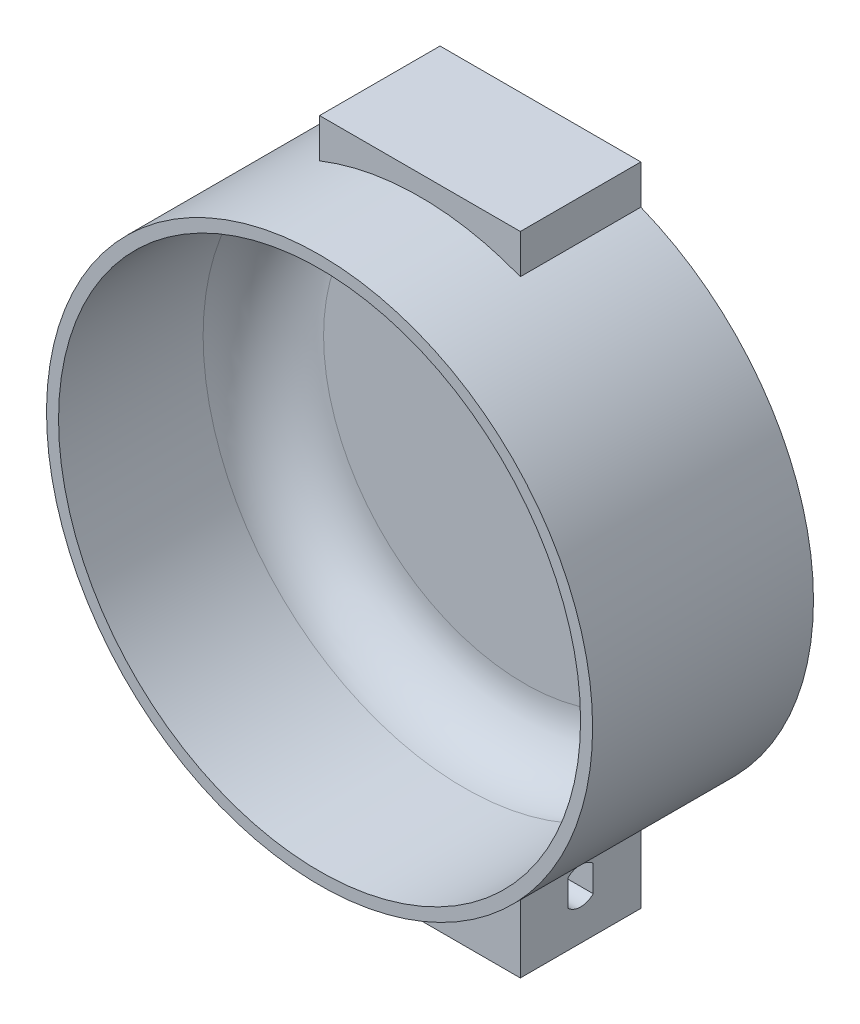
ISO-10303-21;
HEADER;
FILE_DESCRIPTION(('STEP AP214'),'2;1');
FILE_NAME('part.step','',(''),(''),'','','');
FILE_SCHEMA(('AUTOMOTIVE_DESIGN { 1 0 10303 214 1 1 1 1 }'));
ENDSEC;
DATA;
#1=APPLICATION_CONTEXT('core data for automotive mechanical design processes');
#2=APPLICATION_PROTOCOL_DEFINITION('international standard','automotive_design',2000,#1);
#3=PRODUCT_CONTEXT('',#1,'mechanical');
#4=PRODUCT('Part','Part','',(#3));
#5=PRODUCT_RELATED_PRODUCT_CATEGORY('part','',(#4));
#6=PRODUCT_DEFINITION_FORMATION('','',#4);
#7=PRODUCT_DEFINITION_CONTEXT('part definition',#1,'design');
#8=PRODUCT_DEFINITION('design','',#6,#7);
#9=PRODUCT_DEFINITION_SHAPE('','',#8);
#10=(LENGTH_UNIT() NAMED_UNIT(*) SI_UNIT(.MILLI.,.METRE.));
#11=(NAMED_UNIT(*) PLANE_ANGLE_UNIT() SI_UNIT($,.RADIAN.));
#12=(NAMED_UNIT(*) SI_UNIT($,.STERADIAN.) SOLID_ANGLE_UNIT());
#13=UNCERTAINTY_MEASURE_WITH_UNIT(LENGTH_MEASURE(1.E-05),#10,'distance_accuracy_value','');
#14=(GEOMETRIC_REPRESENTATION_CONTEXT(3) GLOBAL_UNCERTAINTY_ASSIGNED_CONTEXT((#13)) GLOBAL_UNIT_ASSIGNED_CONTEXT((#10,
#11,#12)) REPRESENTATION_CONTEXT('',''));
#15=CARTESIAN_POINT('',(0.,0.,0.));
#16=DIRECTION('',(0.,0.,1.));
#17=DIRECTION('',(1.,0.,0.));
#18=AXIS2_PLACEMENT_3D('',#15,#16,#17);
#19=CARTESIAN_POINT('',(25.,0.,30.));
#20=DIRECTION('',(-1.,0.,0.));
#21=DIRECTION('',(0.,0.,1.));
#22=AXIS2_PLACEMENT_3D('',#19,#20,#21);
#23=PLANE('',#22);
#24=DIRECTION('',(0.,1.,0.));
#25=VECTOR('',#24,1.);
#26=CARTESIAN_POINT('',(25.,0.,0.));
#27=LINE('',#26,#25);
#28=CARTESIAN_POINT('',(25.,-88.,0.));
#29=VERTEX_POINT('',#28);
#30=CARTESIAN_POINT('',(25.,-63.2376470150495,0.));
#31=VERTEX_POINT('',#30);
#32=EDGE_CURVE('E199',#29,#31,#27,.T.);
#33=ORIENTED_EDGE('',*,*,#32,.T.);
#34=DIRECTION('',(0.,0.,-1.));
#35=VECTOR('',#34,1.);
#36=CARTESIAN_POINT('',(25.,-63.2376470150495,30.));
#37=LINE('',#36,#35);
#38=CARTESIAN_POINT('',(25.,-63.2376470150495,30.));
#39=VERTEX_POINT('',#38);
#40=EDGE_CURVE('E206',#39,#31,#37,.T.);
#41=ORIENTED_EDGE('',*,*,#40,.F.);
#42=DIRECTION('',(0.,1.,0.));
#43=VECTOR('',#42,1.);
#44=CARTESIAN_POINT('',(25.,0.,30.));
#45=LINE('',#44,#43);
#46=CARTESIAN_POINT('',(25.,-88.,30.));
#47=VERTEX_POINT('',#46);
#48=EDGE_CURVE('E195',#47,#39,#45,.T.);
#49=ORIENTED_EDGE('',*,*,#48,.F.);
#50=DIRECTION('',(0.,0.,1.));
#51=VECTOR('',#50,1.);
#52=CARTESIAN_POINT('',(25.,-88.,0.));
#53=LINE('',#52,#51);
#54=EDGE_CURVE('E183',#29,#47,#53,.T.);
#55=ORIENTED_EDGE('',*,*,#54,.F.);
#56=EDGE_LOOP('',(#33,#41,#49,#55));
#57=FACE_BOUND('',#56,.T.);
#58=CARTESIAN_POINT('',(25.,-75.6188235075248,15.));
#59=DIRECTION('',(1.,0.,0.));
#60=DIRECTION('',(0.,0.,-1.));
#61=AXIS2_PLACEMENT_3D('',#58,#59,#60);
#62=CIRCLE('',#61,4.55);
#63=CARTESIAN_POINT('',(25.,-72.3355324756484,11.85));
#64=VERTEX_POINT('',#63);
#65=CARTESIAN_POINT('',(25.,-72.3355324756484,18.15));
#66=VERTEX_POINT('',#65);
#67=EDGE_CURVE('E62',#64,#66,#62,.T.);
#68=ORIENTED_EDGE('',*,*,#67,.F.);
#69=DIRECTION('',(0.,-1.,0.));
#70=VECTOR('',#69,1.);
#71=CARTESIAN_POINT('',(25.,0.,11.85));
#72=LINE('',#71,#70);
#73=CARTESIAN_POINT('',(25.,-78.9021145394012,11.85));
#74=VERTEX_POINT('',#73);
#75=EDGE_CURVE('E145',#64,#74,#72,.T.);
#76=ORIENTED_EDGE('',*,*,#75,.T.);
#77=CARTESIAN_POINT('',(25.,-75.6188235075248,15.));
#78=DIRECTION('',(1.,0.,0.));
#79=DIRECTION('',(0.,0.,-1.));
#80=AXIS2_PLACEMENT_3D('',#77,#78,#79);
#81=CIRCLE('',#80,4.55);
#82=CARTESIAN_POINT('',(25.,-78.9021145394012,18.15));
#83=VERTEX_POINT('',#82);
#84=EDGE_CURVE('E156',#83,#74,#81,.T.);
#85=ORIENTED_EDGE('',*,*,#84,.F.);
#86=DIRECTION('',(0.,-1.,0.));
#87=VECTOR('',#86,1.);
#88=CARTESIAN_POINT('',(25.,0.,18.15));
#89=LINE('',#88,#87);
#90=EDGE_CURVE('E166',#66,#83,#89,.T.);
#91=ORIENTED_EDGE('',*,*,#90,.F.);
#92=EDGE_LOOP('',(#68,#76,#85,#91));
#93=FACE_BOUND('',#92,.T.);
#94=ADVANCED_FACE('F47',(#57,#93),#23,.F.);
#95=CARTESIAN_POINT('',(0.,0.,55.));
#96=DIRECTION('',(0.,0.,-1.));
#97=DIRECTION('',(-1.,0.,0.));
#98=AXIS2_PLACEMENT_3D('',#95,#96,#97);
#99=CYLINDRICAL_SURFACE('',#98,68.);
#100=CARTESIAN_POINT('',(0.,0.,55.));
#101=DIRECTION('',(0.,0.,1.));
#102=DIRECTION('',(1.,0.,0.));
#103=AXIS2_PLACEMENT_3D('',#100,#101,#102);
#104=CIRCLE('',#103,68.);
#105=CARTESIAN_POINT('',(68.,0.,55.));
#106=VERTEX_POINT('',#105);
#107=EDGE_CURVE('E243',#106,#106,#104,.T.);
#108=ORIENTED_EDGE('',*,*,#107,.F.);
#109=EDGE_LOOP('',(#108));
#110=FACE_BOUND('',#109,.T.);
#111=DIRECTION('',(0.,0.,-1.));
#112=VECTOR('',#111,1.);
#113=CARTESIAN_POINT('',(-25.,-63.2376470150495,30.));
#114=LINE('',#113,#112);
#115=CARTESIAN_POINT('',(-25.,-63.2376470150495,30.));
#116=VERTEX_POINT('',#115);
#117=CARTESIAN_POINT('',(-25.,-63.2376470150495,0.));
#118=VERTEX_POINT('',#117);
#119=EDGE_CURVE('E200',#116,#118,#114,.T.);
#120=ORIENTED_EDGE('',*,*,#119,.F.);
#121=CARTESIAN_POINT('',(0.,0.,30.));
#122=DIRECTION('',(0.,0.,-1.));
#123=DIRECTION('',(-1.,0.,0.));
#124=AXIS2_PLACEMENT_3D('',#121,#122,#123);
#125=CIRCLE('',#124,68.);
#126=EDGE_CURVE('E71',#39,#116,#125,.T.);
#127=ORIENTED_EDGE('',*,*,#126,.F.);
#128=ORIENTED_EDGE('',*,*,#40,.T.);
#129=CARTESIAN_POINT('',(0.,0.,0.));
#130=DIRECTION('',(0.,0.,1.));
#131=DIRECTION('',(1.,0.,0.));
#132=AXIS2_PLACEMENT_3D('',#129,#130,#131);
#133=CIRCLE('',#132,68.);
#134=CARTESIAN_POINT('',(25.,63.2376470150495,0.));
#135=VERTEX_POINT('',#134);
#136=EDGE_CURVE('E238',#31,#135,#133,.T.);
#137=ORIENTED_EDGE('',*,*,#136,.T.);
#138=DIRECTION('',(0.,0.,-1.));
#139=VECTOR('',#138,1.);
#140=CARTESIAN_POINT('',(25.,63.2376470150495,30.));
#141=LINE('',#140,#139);
#142=CARTESIAN_POINT('',(25.,63.2376470150495,30.));
#143=VERTEX_POINT('',#142);
#144=EDGE_CURVE('E233',#143,#135,#141,.T.);
#145=ORIENTED_EDGE('',*,*,#144,.F.);
#146=CARTESIAN_POINT('',(0.,0.,30.));
#147=DIRECTION('',(0.,0.,-1.));
#148=DIRECTION('',(-1.,0.,0.));
#149=AXIS2_PLACEMENT_3D('',#146,#147,#148);
#150=CIRCLE('',#149,68.);
#151=CARTESIAN_POINT('',(-25.,63.2376470150495,30.));
#152=VERTEX_POINT('',#151);
#153=EDGE_CURVE('E219',#152,#143,#150,.T.);
#154=ORIENTED_EDGE('',*,*,#153,.F.);
#155=DIRECTION('',(0.,0.,-1.));
#156=VECTOR('',#155,1.);
#157=CARTESIAN_POINT('',(-25.,63.2376470150495,30.));
#158=LINE('',#157,#156);
#159=CARTESIAN_POINT('',(-25.,63.2376470150495,0.));
#160=VERTEX_POINT('',#159);
#161=EDGE_CURVE('E201',#152,#160,#158,.T.);
#162=ORIENTED_EDGE('',*,*,#161,.T.);
#163=EDGE_CURVE('E244',#160,#118,#133,.T.);
#164=ORIENTED_EDGE('',*,*,#163,.T.);
#165=EDGE_LOOP('',(#120,#127,#128,#137,#145,#154,#162,#164));
#166=FACE_BOUND('',#165,.T.);
#167=ADVANCED_FACE('F267',(#110,#166),#99,.T.);
#168=CARTESIAN_POINT('',(0.,0.,55.));
#169=DIRECTION('',(0.,0.,-1.));
#170=DIRECTION('',(-1.,0.,0.));
#171=AXIS2_PLACEMENT_3D('',#168,#169,#170);
#172=CYLINDRICAL_SURFACE('',#171,65.);
#173=CARTESIAN_POINT('',(0.,0.,19.));
#174=DIRECTION('',(0.,0.,-1.));
#175=DIRECTION('',(-1.,0.,0.));
#176=AXIS2_PLACEMENT_3D('',#173,#174,#175);
#177=CIRCLE('',#176,65.);
#178=CARTESIAN_POINT('',(-65.,0.,19.));
#179=VERTEX_POINT('',#178);
#180=EDGE_CURVE('E59',#179,#179,#177,.T.);
#181=ORIENTED_EDGE('',*,*,#180,.T.);
#182=EDGE_LOOP('',(#181));
#183=FACE_BOUND('',#182,.T.);
#184=CARTESIAN_POINT('',(0.,0.,55.));
#185=DIRECTION('',(0.,0.,1.));
#186=DIRECTION('',(1.,0.,0.));
#187=AXIS2_PLACEMENT_3D('',#184,#185,#186);
#188=CIRCLE('',#187,65.);
#189=CARTESIAN_POINT('',(65.,0.,55.));
#190=VERTEX_POINT('',#189);
#191=EDGE_CURVE('E208',#190,#190,#188,.T.);
#192=ORIENTED_EDGE('',*,*,#191,.T.);
#193=EDGE_LOOP('',(#192));
#194=FACE_BOUND('',#193,.T.);
#195=ADVANCED_FACE('F249',(#183,#194),#172,.F.);
#196=CARTESIAN_POINT('',(0.,0.,55.));
#197=DIRECTION('',(0.,0.,1.));
#198=DIRECTION('',(1.,0.,0.));
#199=AXIS2_PLACEMENT_3D('',#196,#197,#198);
#200=PLANE('',#199);
#201=ORIENTED_EDGE('',*,*,#107,.T.);
#202=EDGE_LOOP('',(#201));
#203=FACE_BOUND('',#202,.T.);
#204=ORIENTED_EDGE('',*,*,#191,.F.);
#205=EDGE_LOOP('',(#204));
#206=FACE_BOUND('',#205,.T.);
#207=ADVANCED_FACE('F293',(#203,#206),#200,.T.);
#208=CARTESIAN_POINT('',(0.,0.,0.));
#209=DIRECTION('',(0.,0.,1.));
#210=DIRECTION('',(1.,0.,0.));
#211=AXIS2_PLACEMENT_3D('',#208,#209,#210);
#212=PLANE('',#211);
#213=ORIENTED_EDGE('',*,*,#163,.F.);
#214=DIRECTION('',(0.,-1.,0.));
#215=VECTOR('',#214,1.);
#216=CARTESIAN_POINT('',(-25.0000000000001,0.,0.));
#217=LINE('',#216,#215);
#218=CARTESIAN_POINT('',(-25.,73.,0.));
#219=VERTEX_POINT('',#218);
#220=EDGE_CURVE('E193',#219,#160,#217,.T.);
#221=ORIENTED_EDGE('',*,*,#220,.F.);
#222=DIRECTION('',(-1.,0.,0.));
#223=VECTOR('',#222,1.);
#224=CARTESIAN_POINT('',(0.,73.,0.));
#225=LINE('',#224,#223);
#226=CARTESIAN_POINT('',(25.,73.,0.));
#227=VERTEX_POINT('',#226);
#228=EDGE_CURVE('E228',#227,#219,#225,.T.);
#229=ORIENTED_EDGE('',*,*,#228,.F.);
#230=DIRECTION('',(0.,-1.,0.));
#231=VECTOR('',#230,1.);
#232=CARTESIAN_POINT('',(25.,0.,0.));
#233=LINE('',#232,#231);
#234=EDGE_CURVE('E214',#227,#135,#233,.T.);
#235=ORIENTED_EDGE('',*,*,#234,.T.);
#236=ORIENTED_EDGE('',*,*,#136,.F.);
#237=ORIENTED_EDGE('',*,*,#32,.F.);
#238=DIRECTION('',(1.,0.,0.));
#239=VECTOR('',#238,1.);
#240=CARTESIAN_POINT('',(-25.,-88.,0.));
#241=LINE('',#240,#239);
#242=CARTESIAN_POINT('',(-25.,-88.,0.));
#243=VERTEX_POINT('',#242);
#244=EDGE_CURVE('E185',#243,#29,#241,.T.);
#245=ORIENTED_EDGE('',*,*,#244,.F.);
#246=DIRECTION('',(0.,1.,0.));
#247=VECTOR('',#246,1.);
#248=CARTESIAN_POINT('',(-25.0000000000001,0.,0.));
#249=LINE('',#248,#247);
#250=EDGE_CURVE('E192',#243,#118,#249,.T.);
#251=ORIENTED_EDGE('',*,*,#250,.T.);
#252=EDGE_LOOP('',(#213,#221,#229,#235,#236,#237,#245,#251));
#253=FACE_BOUND('',#252,.T.);
#254=ADVANCED_FACE('F262',(#253),#212,.F.);
#255=CARTESIAN_POINT('',(0.,0.,4.));
#256=DIRECTION('',(0.,0.,-1.));
#257=DIRECTION('',(-1.,0.,0.));
#258=AXIS2_PLACEMENT_3D('',#255,#256,#257);
#259=PLANE('',#258);
#260=CARTESIAN_POINT('',(0.,0.,4.));
#261=DIRECTION('',(0.,0.,-1.));
#262=DIRECTION('',(-1.,0.,0.));
#263=AXIS2_PLACEMENT_3D('',#260,#261,#262);
#264=CIRCLE('',#263,50.);
#265=CARTESIAN_POINT('',(-50.,0.,4.));
#266=VERTEX_POINT('',#265);
#267=EDGE_CURVE('E12',#266,#266,#264,.F.);
#268=ORIENTED_EDGE('',*,*,#267,.T.);
#269=EDGE_LOOP('',(#268));
#270=FACE_BOUND('',#269,.T.);
#271=ADVANCED_FACE('F255',(#270),#259,.F.);
#272=CARTESIAN_POINT('',(0.,0.,19.));
#273=DIRECTION('',(0.,0.,-1.));
#274=DIRECTION('',(-1.,0.,0.));
#275=AXIS2_PLACEMENT_3D('',#272,#273,#274);
#276=TOROIDAL_SURFACE('',#275,50.,15.);
#277=ORIENTED_EDGE('',*,*,#267,.F.);
#278=EDGE_LOOP('',(#277));
#279=FACE_BOUND('',#278,.T.);
#280=ORIENTED_EDGE('',*,*,#180,.F.);
#281=EDGE_LOOP('',(#280));
#282=FACE_BOUND('',#281,.T.);
#283=ADVANCED_FACE('F51',(#279,#282),#276,.F.);
#284=CARTESIAN_POINT('',(-25.0000000000001,0.,30.));
#285=DIRECTION('',(1.,0.,0.));
#286=DIRECTION('',(0.,1.,0.));
#287=AXIS2_PLACEMENT_3D('',#284,#285,#286);
#288=PLANE('',#287);
#289=ORIENTED_EDGE('',*,*,#220,.T.);
#290=ORIENTED_EDGE('',*,*,#161,.F.);
#291=DIRECTION('',(0.,-1.,0.));
#292=VECTOR('',#291,1.);
#293=CARTESIAN_POINT('',(-25.0000000000001,0.,30.));
#294=LINE('',#293,#292);
#295=CARTESIAN_POINT('',(-25.,73.,30.));
#296=VERTEX_POINT('',#295);
#297=EDGE_CURVE('E211',#296,#152,#294,.T.);
#298=ORIENTED_EDGE('',*,*,#297,.F.);
#299=DIRECTION('',(0.,0.,-1.));
#300=VECTOR('',#299,1.);
#301=CARTESIAN_POINT('',(-25.,73.,30.));
#302=LINE('',#301,#300);
#303=EDGE_CURVE('E224',#296,#219,#302,.T.);
#304=ORIENTED_EDGE('',*,*,#303,.T.);
#305=EDGE_LOOP('',(#289,#290,#298,#304));
#306=FACE_BOUND('',#305,.T.);
#307=ADVANCED_FACE('F251',(#306),#288,.F.);
#308=CARTESIAN_POINT('',(25.,0.,30.));
#309=DIRECTION('',(1.,0.,0.));
#310=DIRECTION('',(0.,0.,-1.));
#311=AXIS2_PLACEMENT_3D('',#308,#309,#310);
#312=PLANE('',#311);
#313=ORIENTED_EDGE('',*,*,#234,.F.);
#314=DIRECTION('',(0.,0.,-1.));
#315=VECTOR('',#314,1.);
#316=CARTESIAN_POINT('',(25.,73.,30.));
#317=LINE('',#316,#315);
#318=CARTESIAN_POINT('',(25.,73.,30.));
#319=VERTEX_POINT('',#318);
#320=EDGE_CURVE('E234',#319,#227,#317,.T.);
#321=ORIENTED_EDGE('',*,*,#320,.F.);
#322=DIRECTION('',(0.,-1.,0.));
#323=VECTOR('',#322,1.);
#324=CARTESIAN_POINT('',(25.,0.,30.));
#325=LINE('',#324,#323);
#326=EDGE_CURVE('E220',#319,#143,#325,.T.);
#327=ORIENTED_EDGE('',*,*,#326,.T.);
#328=ORIENTED_EDGE('',*,*,#144,.T.);
#329=EDGE_LOOP('',(#313,#321,#327,#328));
#330=FACE_BOUND('',#329,.T.);
#331=ADVANCED_FACE('F261',(#330),#312,.T.);
#332=CARTESIAN_POINT('',(0.,73.,30.));
#333=DIRECTION('',(0.,-1.,0.));
#334=DIRECTION('',(0.,0.,-1.));
#335=AXIS2_PLACEMENT_3D('',#332,#333,#334);
#336=PLANE('',#335);
#337=ORIENTED_EDGE('',*,*,#228,.T.);
#338=ORIENTED_EDGE('',*,*,#303,.F.);
#339=DIRECTION('',(-1.,0.,0.));
#340=VECTOR('',#339,1.);
#341=CARTESIAN_POINT('',(0.,73.,30.));
#342=LINE('',#341,#340);
#343=EDGE_CURVE('E212',#319,#296,#342,.T.);
#344=ORIENTED_EDGE('',*,*,#343,.F.);
#345=ORIENTED_EDGE('',*,*,#320,.T.);
#346=EDGE_LOOP('',(#337,#338,#344,#345));
#347=FACE_BOUND('',#346,.T.);
#348=ADVANCED_FACE('F282',(#347),#336,.F.);
#349=CARTESIAN_POINT('',(0.,0.,30.));
#350=DIRECTION('',(0.,0.,-1.));
#351=DIRECTION('',(-1.,0.,0.));
#352=AXIS2_PLACEMENT_3D('',#349,#350,#351);
#353=PLANE('',#352);
#354=ORIENTED_EDGE('',*,*,#297,.T.);
#355=ORIENTED_EDGE('',*,*,#153,.T.);
#356=ORIENTED_EDGE('',*,*,#326,.F.);
#357=ORIENTED_EDGE('',*,*,#343,.T.);
#358=EDGE_LOOP('',(#354,#355,#356,#357));
#359=FACE_BOUND('',#358,.T.);
#360=ADVANCED_FACE('F285',(#359),#353,.F.);
#361=CARTESIAN_POINT('',(-25.0000000000001,0.,30.));
#362=DIRECTION('',(-1.,0.,0.));
#363=DIRECTION('',(0.,-1.,0.));
#364=AXIS2_PLACEMENT_3D('',#361,#362,#363);
#365=PLANE('',#364);
#366=ORIENTED_EDGE('',*,*,#250,.F.);
#367=DIRECTION('',(0.,0.,-1.));
#368=VECTOR('',#367,1.);
#369=CARTESIAN_POINT('',(-25.,-88.,30.));
#370=LINE('',#369,#368);
#371=CARTESIAN_POINT('',(-25.,-88.,30.));
#372=VERTEX_POINT('',#371);
#373=EDGE_CURVE('E178',#372,#243,#370,.T.);
#374=ORIENTED_EDGE('',*,*,#373,.F.);
#375=DIRECTION('',(0.,1.,0.));
#376=VECTOR('',#375,1.);
#377=CARTESIAN_POINT('',(-25.0000000000001,0.,30.));
#378=LINE('',#377,#376);
#379=EDGE_CURVE('E194',#372,#116,#378,.T.);
#380=ORIENTED_EDGE('',*,*,#379,.T.);
#381=ORIENTED_EDGE('',*,*,#119,.T.);
#382=EDGE_LOOP('',(#366,#374,#380,#381));
#383=FACE_BOUND('',#382,.T.);
#384=ADVANCED_FACE('F278',(#383),#365,.T.);
#385=CARTESIAN_POINT('',(0.,0.,30.));
#386=DIRECTION('',(0.,0.,-1.));
#387=DIRECTION('',(-1.,0.,0.));
#388=AXIS2_PLACEMENT_3D('',#385,#386,#387);
#389=PLANE('',#388);
#390=CARTESIAN_POINT('',(-4.96819618126027,-75.6188235075248,30.));
#391=DIRECTION('',(0.,0.,-1.));
#392=DIRECTION('',(-1.,0.,0.));
#393=AXIS2_PLACEMENT_3D('',#390,#391,#392);
#394=CIRCLE('',#393,2.8);
#395=CARTESIAN_POINT('',(-7.76819618126027,-75.6188235075248,30.));
#396=VERTEX_POINT('',#395);
#397=EDGE_CURVE('E170',#396,#396,#394,.F.);
#398=ORIENTED_EDGE('',*,*,#397,.F.);
#399=EDGE_LOOP('',(#398));
#400=FACE_BOUND('',#399,.T.);
#401=ORIENTED_EDGE('',*,*,#48,.T.);
#402=ORIENTED_EDGE('',*,*,#126,.T.);
#403=ORIENTED_EDGE('',*,*,#379,.F.);
#404=DIRECTION('',(-1.,0.,0.));
#405=VECTOR('',#404,1.);
#406=CARTESIAN_POINT('',(25.,-88.,30.));
#407=LINE('',#406,#405);
#408=EDGE_CURVE('E186',#47,#372,#407,.T.);
#409=ORIENTED_EDGE('',*,*,#408,.F.);
#410=EDGE_LOOP('',(#401,#402,#403,#409));
#411=FACE_BOUND('',#410,.T.);
#412=ADVANCED_FACE('F325',(#400,#411),#389,.F.);
#413=CARTESIAN_POINT('',(0.,-88.,0.));
#414=DIRECTION('',(0.,-1.,0.));
#415=DIRECTION('',(0.,0.,-1.));
#416=AXIS2_PLACEMENT_3D('',#413,#414,#415);
#417=PLANE('',#416);
#418=ORIENTED_EDGE('',*,*,#373,.T.);
#419=ORIENTED_EDGE('',*,*,#244,.T.);
#420=ORIENTED_EDGE('',*,*,#54,.T.);
#421=ORIENTED_EDGE('',*,*,#408,.T.);
#422=EDGE_LOOP('',(#418,#419,#420,#421));
#423=FACE_BOUND('',#422,.T.);
#424=ADVANCED_FACE('F317',(#423),#417,.T.);
#425=CARTESIAN_POINT('',(-15.,0.,11.85));
#426=DIRECTION('',(0.,0.,1.));
#427=DIRECTION('',(0.,-1.,0.));
#428=AXIS2_PLACEMENT_3D('',#425,#426,#427);
#429=PLANE('',#428);
#430=CARTESIAN_POINT('',(-4.96819618126027,-75.6188235075248,11.85));
#431=DIRECTION('',(0.,0.,1.));
#432=DIRECTION('',(0.,-1.,0.));
#433=AXIS2_PLACEMENT_3D('',#430,#431,#432);
#434=CIRCLE('',#433,2.8);
#435=CARTESIAN_POINT('',(-4.96819618126027,-78.4188235075248,11.85));
#436=VERTEX_POINT('',#435);
#437=EDGE_CURVE('E361',#436,#436,#434,.F.);
#438=ORIENTED_EDGE('',*,*,#437,.T.);
#439=EDGE_LOOP('',(#438));
#440=FACE_BOUND('',#439,.T.);
#441=ORIENTED_EDGE('',*,*,#75,.F.);
#442=DIRECTION('',(1.,0.,0.));
#443=VECTOR('',#442,1.);
#444=CARTESIAN_POINT('',(-15.,-72.3355324756484,11.85));
#445=LINE('',#444,#443);
#446=CARTESIAN_POINT('',(-15.,-72.3355324756484,11.85));
#447=VERTEX_POINT('',#446);
#448=EDGE_CURVE('E136',#447,#64,#445,.T.);
#449=ORIENTED_EDGE('',*,*,#448,.F.);
#450=DIRECTION('',(0.,-1.,0.));
#451=VECTOR('',#450,1.);
#452=CARTESIAN_POINT('',(-15.,0.,11.85));
#453=LINE('',#452,#451);
#454=CARTESIAN_POINT('',(-15.,-78.9021145394012,11.85));
#455=VERTEX_POINT('',#454);
#456=EDGE_CURVE('E143',#447,#455,#453,.T.);
#457=ORIENTED_EDGE('',*,*,#456,.T.);
#458=DIRECTION('',(1.,0.,0.));
#459=VECTOR('',#458,1.);
#460=CARTESIAN_POINT('',(-15.,-78.9021145394012,11.85));
#461=LINE('',#460,#459);
#462=EDGE_CURVE('E174',#455,#74,#461,.T.);
#463=ORIENTED_EDGE('',*,*,#462,.T.);
#464=EDGE_LOOP('',(#441,#449,#457,#463));
#465=FACE_BOUND('',#464,.T.);
#466=ADVANCED_FACE('F137',(#440,#465),#429,.T.);
#467=CARTESIAN_POINT('',(-15.,-75.6188235075248,15.));
#468=DIRECTION('',(1.,0.,0.));
#469=DIRECTION('',(0.,0.,-1.));
#470=AXIS2_PLACEMENT_3D('',#467,#468,#469);
#471=CYLINDRICAL_SURFACE('',#470,4.55);
#472=ORIENTED_EDGE('',*,*,#84,.T.);
#473=ORIENTED_EDGE('',*,*,#462,.F.);
#474=CARTESIAN_POINT('',(-15.,-75.6188235075248,15.));
#475=DIRECTION('',(1.,0.,0.));
#476=DIRECTION('',(0.,0.,-1.));
#477=AXIS2_PLACEMENT_3D('',#474,#475,#476);
#478=CIRCLE('',#477,4.55);
#479=CARTESIAN_POINT('',(-15.,-78.9021145394012,18.15));
#480=VERTEX_POINT('',#479);
#481=EDGE_CURVE('E150',#480,#455,#478,.T.);
#482=ORIENTED_EDGE('',*,*,#481,.F.);
#483=DIRECTION('',(1.,0.,0.));
#484=VECTOR('',#483,1.);
#485=CARTESIAN_POINT('',(-15.,-78.9021145394012,18.15));
#486=LINE('',#485,#484);
#487=EDGE_CURVE('E180',#480,#83,#486,.T.);
#488=ORIENTED_EDGE('',*,*,#487,.T.);
#489=EDGE_LOOP('',(#472,#473,#482,#488));
#490=FACE_BOUND('',#489,.T.);
#491=ADVANCED_FACE('F338',(#490),#471,.F.);
#492=CARTESIAN_POINT('',(-15.,0.,18.15));
#493=DIRECTION('',(0.,0.,1.));
#494=DIRECTION('',(1.,0.,0.));
#495=AXIS2_PLACEMENT_3D('',#492,#493,#494);
#496=PLANE('',#495);
#497=CARTESIAN_POINT('',(-4.96819618126027,-75.6188235075248,18.15));
#498=DIRECTION('',(0.,0.,1.));
#499=DIRECTION('',(1.,0.,0.));
#500=AXIS2_PLACEMENT_3D('',#497,#498,#499);
#501=CIRCLE('',#500,2.8);
#502=CARTESIAN_POINT('',(-2.16819618126027,-75.6188235075248,18.15));
#503=VERTEX_POINT('',#502);
#504=EDGE_CURVE('E52',#503,#503,#501,.F.);
#505=ORIENTED_EDGE('',*,*,#504,.F.);
#506=EDGE_LOOP('',(#505));
#507=FACE_BOUND('',#506,.T.);
#508=ORIENTED_EDGE('',*,*,#90,.T.);
#509=ORIENTED_EDGE('',*,*,#487,.F.);
#510=DIRECTION('',(0.,-1.,0.));
#511=VECTOR('',#510,1.);
#512=CARTESIAN_POINT('',(-15.,0.,18.15));
#513=LINE('',#512,#511);
#514=CARTESIAN_POINT('',(-15.,-72.3355324756484,18.15));
#515=VERTEX_POINT('',#514);
#516=EDGE_CURVE('E159',#515,#480,#513,.T.);
#517=ORIENTED_EDGE('',*,*,#516,.F.);
#518=DIRECTION('',(1.,0.,0.));
#519=VECTOR('',#518,1.);
#520=CARTESIAN_POINT('',(-15.,-72.3355324756484,18.15));
#521=LINE('',#520,#519);
#522=EDGE_CURVE('E148',#515,#66,#521,.T.);
#523=ORIENTED_EDGE('',*,*,#522,.T.);
#524=EDGE_LOOP('',(#508,#509,#517,#523));
#525=FACE_BOUND('',#524,.T.);
#526=ADVANCED_FACE('F337',(#507,#525),#496,.F.);
#527=CARTESIAN_POINT('',(-15.,-75.6188235075248,15.));
#528=DIRECTION('',(1.,0.,0.));
#529=DIRECTION('',(0.,0.,-1.));
#530=AXIS2_PLACEMENT_3D('',#527,#528,#529);
#531=CYLINDRICAL_SURFACE('',#530,4.55);
#532=ORIENTED_EDGE('',*,*,#67,.T.);
#533=ORIENTED_EDGE('',*,*,#522,.F.);
#534=CARTESIAN_POINT('',(-15.,-75.6188235075248,15.));
#535=DIRECTION('',(1.,0.,0.));
#536=DIRECTION('',(0.,0.,-1.));
#537=AXIS2_PLACEMENT_3D('',#534,#535,#536);
#538=CIRCLE('',#537,4.55);
#539=EDGE_CURVE('E152',#447,#515,#538,.T.);
#540=ORIENTED_EDGE('',*,*,#539,.F.);
#541=ORIENTED_EDGE('',*,*,#448,.T.);
#542=EDGE_LOOP('',(#532,#533,#540,#541));
#543=FACE_BOUND('',#542,.T.);
#544=ADVANCED_FACE('F158',(#543),#531,.F.);
#545=CARTESIAN_POINT('',(-15.,0.,0.));
#546=DIRECTION('',(1.,0.,0.));
#547=DIRECTION('',(0.,0.,-1.));
#548=AXIS2_PLACEMENT_3D('',#545,#546,#547);
#549=PLANE('',#548);
#550=ORIENTED_EDGE('',*,*,#456,.F.);
#551=ORIENTED_EDGE('',*,*,#539,.T.);
#552=ORIENTED_EDGE('',*,*,#516,.T.);
#553=ORIENTED_EDGE('',*,*,#481,.T.);
#554=EDGE_LOOP('',(#550,#551,#552,#553));
#555=FACE_BOUND('',#554,.T.);
#556=ADVANCED_FACE('F155',(#555),#549,.T.);
#557=CARTESIAN_POINT('',(-4.96819618126027,-75.6188235075248,8.15));
#558=DIRECTION('',(0.,0.,1.));
#559=DIRECTION('',(1.,0.,0.));
#560=AXIS2_PLACEMENT_3D('',#557,#558,#559);
#561=CYLINDRICAL_SURFACE('',#560,2.8);
#562=ORIENTED_EDGE('',*,*,#504,.T.);
#563=EDGE_LOOP('',(#562));
#564=FACE_BOUND('',#563,.T.);
#565=ORIENTED_EDGE('',*,*,#397,.T.);
#566=EDGE_LOOP('',(#565));
#567=FACE_BOUND('',#566,.T.);
#568=ADVANCED_FACE('F350',(#564,#567),#561,.F.);
#569=ORIENTED_EDGE('',*,*,#437,.F.);
#570=EDGE_LOOP('',(#569));
#571=FACE_BOUND('',#570,.T.);
#572=CARTESIAN_POINT('',(-4.96819618126027,-75.6188235075248,8.15));
#573=DIRECTION('',(0.,0.,-1.));
#574=DIRECTION('',(-1.,0.,0.));
#575=AXIS2_PLACEMENT_3D('',#572,#573,#574);
#576=CIRCLE('',#575,2.8);
#577=CARTESIAN_POINT('',(-7.76819618126027,-75.6188235075248,8.15));
#578=VERTEX_POINT('',#577);
#579=EDGE_CURVE('E359',#578,#578,#576,.T.);
#580=ORIENTED_EDGE('',*,*,#579,.T.);
#581=EDGE_LOOP('',(#580));
#582=FACE_BOUND('',#581,.T.);
#583=ADVANCED_FACE('F346',(#571,#582),#561,.F.);
#584=CARTESIAN_POINT('',(0.,0.,8.15));
#585=DIRECTION('',(0.,0.,-1.));
#586=DIRECTION('',(-1.,0.,0.));
#587=AXIS2_PLACEMENT_3D('',#584,#585,#586);
#588=PLANE('',#587);
#589=ORIENTED_EDGE('',*,*,#579,.F.);
#590=EDGE_LOOP('',(#589));
#591=FACE_BOUND('',#590,.T.);
#592=ADVANCED_FACE('F353',(#591),#588,.F.);
#593=CLOSED_SHELL('',(#94,#167,#195,#207,#254,#271,#283,#307,#331,#348,#360,#384,#412,#424,#466,
#491,#526,#544,#556,#568,#583,#592));
#594=MANIFOLD_SOLID_BREP('B2',#593);
#595=ADVANCED_BREP_SHAPE_REPRESENTATION('',(#18,#594),#14);
#596=SHAPE_DEFINITION_REPRESENTATION(#9,#595);
ENDSEC;
END-ISO-10303-21;
